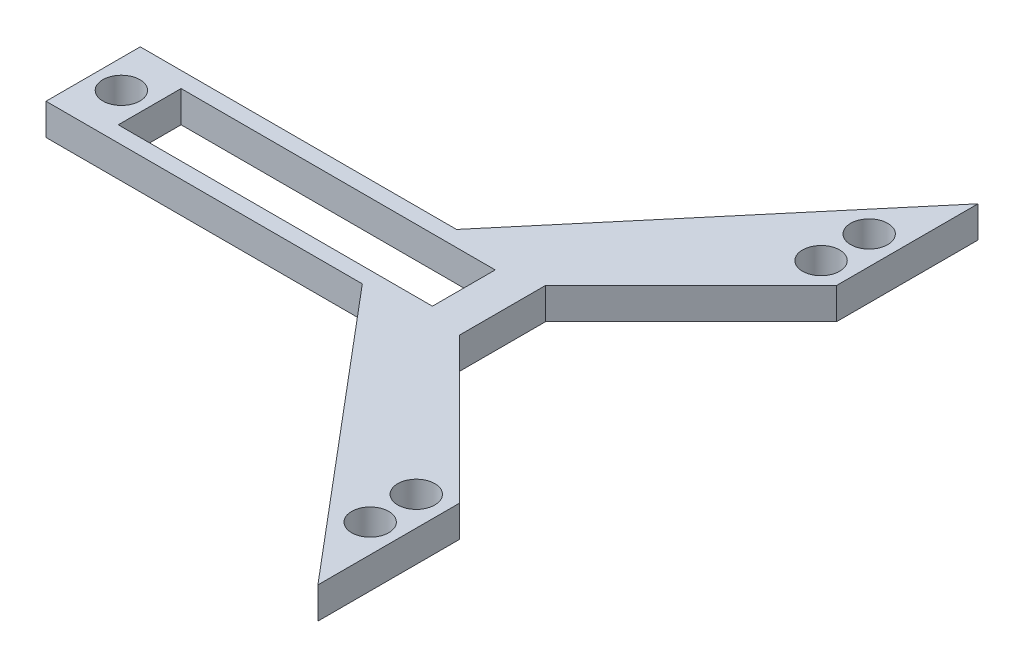
ISO-10303-21;
HEADER;
FILE_DESCRIPTION(('STEP AP214'),'2;1');
FILE_NAME('part.step','',(''),(''),'','','');
FILE_SCHEMA(('AUTOMOTIVE_DESIGN { 1 0 10303 214 1 1 1 1 }'));
ENDSEC;
DATA;
#1=APPLICATION_CONTEXT('core data for automotive mechanical design processes');
#2=APPLICATION_PROTOCOL_DEFINITION('international standard','automotive_design',2000,#1);
#3=PRODUCT_CONTEXT('',#1,'mechanical');
#4=PRODUCT('Part','Part','',(#3));
#5=PRODUCT_RELATED_PRODUCT_CATEGORY('part','',(#4));
#6=PRODUCT_DEFINITION_FORMATION('','',#4);
#7=PRODUCT_DEFINITION_CONTEXT('part definition',#1,'design');
#8=PRODUCT_DEFINITION('design','',#6,#7);
#9=PRODUCT_DEFINITION_SHAPE('','',#8);
#10=(LENGTH_UNIT() NAMED_UNIT(*) SI_UNIT(.MILLI.,.METRE.));
#11=(NAMED_UNIT(*) PLANE_ANGLE_UNIT() SI_UNIT($,.RADIAN.));
#12=(NAMED_UNIT(*) SI_UNIT($,.STERADIAN.) SOLID_ANGLE_UNIT());
#13=UNCERTAINTY_MEASURE_WITH_UNIT(LENGTH_MEASURE(1.E-05),#10,'distance_accuracy_value','');
#14=(GEOMETRIC_REPRESENTATION_CONTEXT(3) GLOBAL_UNCERTAINTY_ASSIGNED_CONTEXT((#13)) GLOBAL_UNIT_ASSIGNED_CONTEXT((#10,
#11,#12)) REPRESENTATION_CONTEXT('',''));
#15=CARTESIAN_POINT('',(0.,0.,0.));
#16=DIRECTION('',(0.,0.,1.));
#17=DIRECTION('',(1.,0.,0.));
#18=AXIS2_PLACEMENT_3D('',#15,#16,#17);
#19=CARTESIAN_POINT('',(-4.29581905287449,2.54,1.27));
#20=DIRECTION('',(0.764582572247931,0.,-0.644525787082827));
#21=DIRECTION('',(-0.644525787082827,0.,-0.764582572247931));
#22=AXIS2_PLACEMENT_3D('',#19,#20,#21);
#23=PLANE('',#22);
#24=DIRECTION('',(0.644525787082827,0.,0.764582572247931));
#25=VECTOR('',#24,1.);
#26=CARTESIAN_POINT('',(-4.29581905287449,0.,1.27));
#27=LINE('',#26,#25);
#28=CARTESIAN_POINT('',(-4.29581905287449,0.,1.27));
#29=VERTEX_POINT('',#28);
#30=CARTESIAN_POINT('',(14.9882776267843,0.,24.1461742948177));
#31=VERTEX_POINT('',#30);
#32=EDGE_CURVE('E228',#29,#31,#27,.T.);
#33=ORIENTED_EDGE('',*,*,#32,.T.);
#34=DIRECTION('',(0.,-1.,0.));
#35=VECTOR('',#34,1.);
#36=CARTESIAN_POINT('',(14.9882776267843,2.54,24.1461742948177));
#37=LINE('',#36,#35);
#38=CARTESIAN_POINT('',(14.9882776267843,2.54,24.1461742948177));
#39=VERTEX_POINT('',#38);
#40=EDGE_CURVE('E11',#39,#31,#37,.T.);
#41=ORIENTED_EDGE('',*,*,#40,.F.);
#42=DIRECTION('',(0.644525787082827,0.,0.764582572247931));
#43=VECTOR('',#42,1.);
#44=CARTESIAN_POINT('',(-4.29581905287449,2.54,1.27));
#45=LINE('',#44,#43);
#46=CARTESIAN_POINT('',(-4.29581905287449,2.54,1.27));
#47=VERTEX_POINT('',#46);
#48=EDGE_CURVE('E194',#47,#39,#45,.T.);
#49=ORIENTED_EDGE('',*,*,#48,.F.);
#50=DIRECTION('',(0.,-1.,0.));
#51=VECTOR('',#50,1.);
#52=CARTESIAN_POINT('',(-4.29581905287449,2.54,1.27));
#53=LINE('',#52,#51);
#54=EDGE_CURVE('E226',#47,#29,#53,.T.);
#55=ORIENTED_EDGE('',*,*,#54,.T.);
#56=EDGE_LOOP('',(#33,#41,#49,#55));
#57=FACE_BOUND('',#56,.T.);
#58=ADVANCED_FACE('F44',(#57),#23,.F.);
#59=CARTESIAN_POINT('',(14.9882776267843,2.54,24.1461742948177));
#60=DIRECTION('',(-1.,0.,0.));
#61=DIRECTION('',(0.,0.,1.));
#62=AXIS2_PLACEMENT_3D('',#59,#60,#61);
#63=PLANE('',#62);
#64=DIRECTION('',(0.,0.,-1.));
#65=VECTOR('',#64,1.);
#66=CARTESIAN_POINT('',(14.9882776267843,0.,24.1461742948177));
#67=LINE('',#66,#65);
#68=CARTESIAN_POINT('',(14.9882776267843,0.,12.7161742948177));
#69=VERTEX_POINT('',#68);
#70=EDGE_CURVE('E231',#31,#69,#67,.T.);
#71=ORIENTED_EDGE('',*,*,#70,.T.);
#72=DIRECTION('',(0.,-1.,0.));
#73=VECTOR('',#72,1.);
#74=CARTESIAN_POINT('',(14.9882776267843,2.54,12.7161742948177));
#75=LINE('',#74,#73);
#76=CARTESIAN_POINT('',(14.9882776267843,2.54,12.7161742948177));
#77=VERTEX_POINT('',#76);
#78=EDGE_CURVE('E52',#77,#69,#75,.T.);
#79=ORIENTED_EDGE('',*,*,#78,.F.);
#80=DIRECTION('',(0.,0.,-1.));
#81=VECTOR('',#80,1.);
#82=CARTESIAN_POINT('',(14.9882776267843,2.54,24.1461742948177));
#83=LINE('',#82,#81);
#84=EDGE_CURVE('E198',#39,#77,#83,.T.);
#85=ORIENTED_EDGE('',*,*,#84,.F.);
#86=ORIENTED_EDGE('',*,*,#40,.T.);
#87=EDGE_LOOP('',(#71,#79,#85,#86));
#88=FACE_BOUND('',#87,.T.);
#89=ADVANCED_FACE('F296',(#88),#63,.F.);
#90=CARTESIAN_POINT('',(3.22186842591949,2.54,0.949765093952835));
#91=DIRECTION('',(0.707106781186549,0.,-0.707106781186546));
#92=DIRECTION('',(-0.707106781186546,0.,-0.707106781186549));
#93=AXIS2_PLACEMENT_3D('',#90,#91,#92);
#94=PLANE('',#93);
#95=DIRECTION('',(0.707106781186546,0.,0.707106781186549));
#96=VECTOR('',#95,1.);
#97=CARTESIAN_POINT('',(3.22186842591949,0.,0.949765093952835));
#98=LINE('',#97,#96);
#99=CARTESIAN_POINT('',(3.22186842591949,0.,0.949765093952835));
#100=VERTEX_POINT('',#99);
#101=EDGE_CURVE('E239',#100,#69,#98,.T.);
#102=ORIENTED_EDGE('',*,*,#101,.F.);
#103=DIRECTION('',(0.,-1.,0.));
#104=VECTOR('',#103,1.);
#105=CARTESIAN_POINT('',(3.22186842591949,2.54,0.949765093952835));
#106=LINE('',#105,#104);
#107=CARTESIAN_POINT('',(3.22186842591949,2.54,0.949765093952835));
#108=VERTEX_POINT('',#107);
#109=EDGE_CURVE('E288',#108,#100,#106,.T.);
#110=ORIENTED_EDGE('',*,*,#109,.F.);
#111=DIRECTION('',(0.707106781186546,0.,0.707106781186549));
#112=VECTOR('',#111,1.);
#113=CARTESIAN_POINT('',(3.22186842591949,2.54,0.949765093952835));
#114=LINE('',#113,#112);
#115=EDGE_CURVE('E199',#108,#77,#114,.T.);
#116=ORIENTED_EDGE('',*,*,#115,.T.);
#117=ORIENTED_EDGE('',*,*,#78,.T.);
#118=EDGE_LOOP('',(#102,#110,#116,#117));
#119=FACE_BOUND('',#118,.T.);
#120=ADVANCED_FACE('F297',(#119),#94,.T.);
#121=CARTESIAN_POINT('',(3.22186842591949,2.54,0.949765093952835));
#122=DIRECTION('',(-1.,0.,0.));
#123=DIRECTION('',(0.,0.,1.));
#124=AXIS2_PLACEMENT_3D('',#121,#122,#123);
#125=PLANE('',#124);
#126=DIRECTION('',(0.,0.,-1.));
#127=VECTOR('',#126,1.);
#128=CARTESIAN_POINT('',(3.22186842591949,0.,0.949765093952835));
#129=LINE('',#128,#127);
#130=CARTESIAN_POINT('',(3.22186842591949,0.,-6.02976509395282));
#131=VERTEX_POINT('',#130);
#132=EDGE_CURVE('E244',#100,#131,#129,.T.);
#133=ORIENTED_EDGE('',*,*,#132,.T.);
#134=DIRECTION('',(0.,-1.,0.));
#135=VECTOR('',#134,1.);
#136=CARTESIAN_POINT('',(3.22186842591949,2.54,-6.02976509395282));
#137=LINE('',#136,#135);
#138=CARTESIAN_POINT('',(3.22186842591949,2.54,-6.02976509395282));
#139=VERTEX_POINT('',#138);
#140=EDGE_CURVE('E287',#139,#131,#137,.T.);
#141=ORIENTED_EDGE('',*,*,#140,.F.);
#142=DIRECTION('',(0.,0.,-1.));
#143=VECTOR('',#142,1.);
#144=CARTESIAN_POINT('',(3.22186842591949,2.54,0.949765093952835));
#145=LINE('',#144,#143);
#146=EDGE_CURVE('E204',#108,#139,#145,.T.);
#147=ORIENTED_EDGE('',*,*,#146,.F.);
#148=ORIENTED_EDGE('',*,*,#109,.T.);
#149=EDGE_LOOP('',(#133,#141,#147,#148));
#150=FACE_BOUND('',#149,.T.);
#151=ADVANCED_FACE('F306',(#150),#125,.F.);
#152=CARTESIAN_POINT('',(3.22186842591949,2.54,-6.02976509395282));
#153=DIRECTION('',(-0.707106781186549,0.,-0.707106781186546));
#154=DIRECTION('',(-0.707106781186546,0.,0.707106781186549));
#155=AXIS2_PLACEMENT_3D('',#152,#153,#154);
#156=PLANE('',#155);
#157=DIRECTION('',(0.707106781186546,0.,-0.707106781186549));
#158=VECTOR('',#157,1.);
#159=CARTESIAN_POINT('',(3.22186842591949,0.,-6.02976509395282));
#160=LINE('',#159,#158);
#161=CARTESIAN_POINT('',(14.9882776267843,0.,-17.7961742948177));
#162=VERTEX_POINT('',#161);
#163=EDGE_CURVE('E247',#131,#162,#160,.T.);
#164=ORIENTED_EDGE('',*,*,#163,.T.);
#165=DIRECTION('',(0.,-1.,0.));
#166=VECTOR('',#165,1.);
#167=CARTESIAN_POINT('',(14.9882776267843,2.54,-17.7961742948177));
#168=LINE('',#167,#166);
#169=CARTESIAN_POINT('',(14.9882776267843,2.54,-17.7961742948177));
#170=VERTEX_POINT('',#169);
#171=EDGE_CURVE('E284',#170,#162,#168,.T.);
#172=ORIENTED_EDGE('',*,*,#171,.F.);
#173=DIRECTION('',(0.707106781186546,0.,-0.707106781186549));
#174=VECTOR('',#173,1.);
#175=CARTESIAN_POINT('',(3.22186842591949,2.54,-6.02976509395282));
#176=LINE('',#175,#174);
#177=EDGE_CURVE('E210',#139,#170,#176,.T.);
#178=ORIENTED_EDGE('',*,*,#177,.F.);
#179=ORIENTED_EDGE('',*,*,#140,.T.);
#180=EDGE_LOOP('',(#164,#172,#178,#179));
#181=FACE_BOUND('',#180,.T.);
#182=ADVANCED_FACE('F315',(#181),#156,.F.);
#183=CARTESIAN_POINT('',(14.9882776267843,2.54,-29.2261742948177));
#184=DIRECTION('',(1.,0.,0.));
#185=DIRECTION('',(0.,0.,-1.));
#186=AXIS2_PLACEMENT_3D('',#183,#184,#185);
#187=PLANE('',#186);
#188=DIRECTION('',(0.,0.,1.));
#189=VECTOR('',#188,1.);
#190=CARTESIAN_POINT('',(14.9882776267843,0.,-29.2261742948177));
#191=LINE('',#190,#189);
#192=CARTESIAN_POINT('',(14.9882776267843,0.,-29.2261742948177));
#193=VERTEX_POINT('',#192);
#194=EDGE_CURVE('E248',#193,#162,#191,.T.);
#195=ORIENTED_EDGE('',*,*,#194,.F.);
#196=DIRECTION('',(0.,-1.,0.));
#197=VECTOR('',#196,1.);
#198=CARTESIAN_POINT('',(14.9882776267843,2.54,-29.2261742948177));
#199=LINE('',#198,#197);
#200=CARTESIAN_POINT('',(14.9882776267843,2.54,-29.2261742948177));
#201=VERTEX_POINT('',#200);
#202=EDGE_CURVE('E278',#201,#193,#199,.T.);
#203=ORIENTED_EDGE('',*,*,#202,.F.);
#204=DIRECTION('',(0.,0.,1.));
#205=VECTOR('',#204,1.);
#206=CARTESIAN_POINT('',(14.9882776267843,2.54,-29.2261742948177));
#207=LINE('',#206,#205);
#208=EDGE_CURVE('E209',#201,#170,#207,.T.);
#209=ORIENTED_EDGE('',*,*,#208,.T.);
#210=ORIENTED_EDGE('',*,*,#171,.T.);
#211=EDGE_LOOP('',(#195,#203,#209,#210));
#212=FACE_BOUND('',#211,.T.);
#213=ADVANCED_FACE('F333',(#212),#187,.T.);
#214=CARTESIAN_POINT('',(-4.29581905287449,2.54,-6.34999999999999));
#215=DIRECTION('',(-0.764582572247931,0.,-0.644525787082827));
#216=DIRECTION('',(-0.644525787082827,0.,0.764582572247931));
#217=AXIS2_PLACEMENT_3D('',#214,#215,#216);
#218=PLANE('',#217);
#219=DIRECTION('',(0.644525787082827,0.,-0.764582572247931));
#220=VECTOR('',#219,1.);
#221=CARTESIAN_POINT('',(-4.29581905287449,0.,-6.34999999999999));
#222=LINE('',#221,#220);
#223=CARTESIAN_POINT('',(-4.29581905287449,0.,-6.34999999999999));
#224=VERTEX_POINT('',#223);
#225=EDGE_CURVE('E255',#224,#193,#222,.T.);
#226=ORIENTED_EDGE('',*,*,#225,.F.);
#227=DIRECTION('',(0.,-1.,0.));
#228=VECTOR('',#227,1.);
#229=CARTESIAN_POINT('',(-4.29581905287449,2.54,-6.34999999999999));
#230=LINE('',#229,#228);
#231=CARTESIAN_POINT('',(-4.29581905287449,2.54,-6.34999999999999));
#232=VERTEX_POINT('',#231);
#233=EDGE_CURVE('E280',#232,#224,#230,.T.);
#234=ORIENTED_EDGE('',*,*,#233,.F.);
#235=DIRECTION('',(0.644525787082827,0.,-0.764582572247931));
#236=VECTOR('',#235,1.);
#237=CARTESIAN_POINT('',(-4.29581905287449,2.54,-6.34999999999999));
#238=LINE('',#237,#236);
#239=EDGE_CURVE('E212',#232,#201,#238,.T.);
#240=ORIENTED_EDGE('',*,*,#239,.T.);
#241=ORIENTED_EDGE('',*,*,#202,.T.);
#242=EDGE_LOOP('',(#226,#234,#240,#241));
#243=FACE_BOUND('',#242,.T.);
#244=ADVANCED_FACE('F332',(#243),#218,.T.);
#245=CARTESIAN_POINT('',(-4.29581905287449,2.54,-6.34999999999999));
#246=DIRECTION('',(0.,0.,1.));
#247=DIRECTION('',(1.,0.,0.));
#248=AXIS2_PLACEMENT_3D('',#245,#246,#247);
#249=PLANE('',#248);
#250=DIRECTION('',(-1.,0.,0.));
#251=VECTOR('',#250,1.);
#252=CARTESIAN_POINT('',(-4.29581905287449,0.,-6.34999999999999));
#253=LINE('',#252,#251);
#254=CARTESIAN_POINT('',(-29.8704,0.,-6.34999999999999));
#255=VERTEX_POINT('',#254);
#256=EDGE_CURVE('E256',#224,#255,#253,.T.);
#257=ORIENTED_EDGE('',*,*,#256,.T.);
#258=DIRECTION('',(0.,-1.,0.));
#259=VECTOR('',#258,1.);
#260=CARTESIAN_POINT('',(-29.8704,2.54,-6.34999999999999));
#261=LINE('',#260,#259);
#262=CARTESIAN_POINT('',(-29.8704,2.54,-6.34999999999999));
#263=VERTEX_POINT('',#262);
#264=EDGE_CURVE('E273',#263,#255,#261,.T.);
#265=ORIENTED_EDGE('',*,*,#264,.F.);
#266=DIRECTION('',(-1.,0.,0.));
#267=VECTOR('',#266,1.);
#268=CARTESIAN_POINT('',(-4.29581905287449,2.54,-6.34999999999999));
#269=LINE('',#268,#267);
#270=EDGE_CURVE('E217',#232,#263,#269,.T.);
#271=ORIENTED_EDGE('',*,*,#270,.F.);
#272=ORIENTED_EDGE('',*,*,#233,.T.);
#273=EDGE_LOOP('',(#257,#265,#271,#272));
#274=FACE_BOUND('',#273,.T.);
#275=ADVANCED_FACE('F344',(#274),#249,.F.);
#276=CARTESIAN_POINT('',(-29.8704,2.54,1.27000000000001));
#277=DIRECTION('',(-1.,0.,0.));
#278=DIRECTION('',(0.,0.,1.));
#279=AXIS2_PLACEMENT_3D('',#276,#277,#278);
#280=PLANE('',#279);
#281=DIRECTION('',(0.,0.,-1.));
#282=VECTOR('',#281,1.);
#283=CARTESIAN_POINT('',(-29.8704,0.,1.27000000000001));
#284=LINE('',#283,#282);
#285=CARTESIAN_POINT('',(-29.8704,0.,1.27000000000001));
#286=VERTEX_POINT('',#285);
#287=EDGE_CURVE('E265',#286,#255,#284,.T.);
#288=ORIENTED_EDGE('',*,*,#287,.F.);
#289=DIRECTION('',(0.,-1.,0.));
#290=VECTOR('',#289,1.);
#291=CARTESIAN_POINT('',(-29.8704,2.54,1.27000000000001));
#292=LINE('',#291,#290);
#293=CARTESIAN_POINT('',(-29.8704,2.54,1.27000000000001));
#294=VERTEX_POINT('',#293);
#295=EDGE_CURVE('E271',#294,#286,#292,.T.);
#296=ORIENTED_EDGE('',*,*,#295,.F.);
#297=DIRECTION('',(0.,0.,-1.));
#298=VECTOR('',#297,1.);
#299=CARTESIAN_POINT('',(-29.8704,2.54,1.27000000000001));
#300=LINE('',#299,#298);
#301=EDGE_CURVE('E222',#294,#263,#300,.T.);
#302=ORIENTED_EDGE('',*,*,#301,.T.);
#303=ORIENTED_EDGE('',*,*,#264,.T.);
#304=EDGE_LOOP('',(#288,#296,#302,#303));
#305=FACE_BOUND('',#304,.T.);
#306=ADVANCED_FACE('F324',(#305),#280,.T.);
#307=CARTESIAN_POINT('',(-4.29581905287449,2.54,1.27));
#308=DIRECTION('',(0.,0.,1.));
#309=DIRECTION('',(1.,0.,0.));
#310=AXIS2_PLACEMENT_3D('',#307,#308,#309);
#311=PLANE('',#310);
#312=DIRECTION('',(-1.,0.,0.));
#313=VECTOR('',#312,1.);
#314=CARTESIAN_POINT('',(-4.29581905287449,0.,1.27));
#315=LINE('',#314,#313);
#316=EDGE_CURVE('E197',#29,#286,#315,.T.);
#317=ORIENTED_EDGE('',*,*,#316,.F.);
#318=ORIENTED_EDGE('',*,*,#54,.F.);
#319=DIRECTION('',(-1.,0.,0.));
#320=VECTOR('',#319,1.);
#321=CARTESIAN_POINT('',(-4.29581905287449,2.54,1.27));
#322=LINE('',#321,#320);
#323=EDGE_CURVE('E223',#47,#294,#322,.T.);
#324=ORIENTED_EDGE('',*,*,#323,.T.);
#325=ORIENTED_EDGE('',*,*,#295,.T.);
#326=EDGE_LOOP('',(#317,#318,#324,#325));
#327=FACE_BOUND('',#326,.T.);
#328=ADVANCED_FACE('F325',(#327),#311,.T.);
#329=CARTESIAN_POINT('',(0.,2.54,0.));
#330=DIRECTION('',(0.,1.,0.));
#331=DIRECTION('',(0.,0.,1.));
#332=AXIS2_PLACEMENT_3D('',#329,#330,#331);
#333=PLANE('',#332);
#334=CARTESIAN_POINT('',(-27.5844,2.54,-2.53999999999999));
#335=DIRECTION('',(0.,1.,0.));
#336=DIRECTION('',(0.,0.,1.));
#337=AXIS2_PLACEMENT_3D('',#334,#335,#336);
#338=CIRCLE('',#337,1.4986);
#339=CARTESIAN_POINT('',(-27.5844,2.54,-1.04139999999999));
#340=VERTEX_POINT('',#339);
#341=EDGE_CURVE('E508',#340,#340,#338,.T.);
#342=ORIENTED_EDGE('',*,*,#341,.F.);
#343=EDGE_LOOP('',(#342));
#344=FACE_BOUND('',#343,.T.);
#345=CARTESIAN_POINT('',(12.7022776267843,2.54,-22.7133111624649));
#346=DIRECTION('',(0.,1.,0.));
#347=DIRECTION('',(0.,0.,1.));
#348=AXIS2_PLACEMENT_3D('',#345,#346,#347);
#349=CIRCLE('',#348,1.4986);
#350=CARTESIAN_POINT('',(12.7022776267843,2.54,-21.2147111624649));
#351=VERTEX_POINT('',#350);
#352=EDGE_CURVE('E515',#351,#351,#349,.T.);
#353=ORIENTED_EDGE('',*,*,#352,.F.);
#354=EDGE_LOOP('',(#353));
#355=FACE_BOUND('',#354,.T.);
#356=CARTESIAN_POINT('',(12.622030753034,2.54,-18.9041563429212));
#357=DIRECTION('',(0.,1.,0.));
#358=DIRECTION('',(0.,0.,1.));
#359=AXIS2_PLACEMENT_3D('',#356,#357,#358);
#360=CIRCLE('',#359,1.4986);
#361=CARTESIAN_POINT('',(12.622030753034,2.54,-17.4055563429212));
#362=VERTEX_POINT('',#361);
#363=EDGE_CURVE('E521',#362,#362,#360,.T.);
#364=ORIENTED_EDGE('',*,*,#363,.F.);
#365=EDGE_LOOP('',(#364));
#366=FACE_BOUND('',#365,.T.);
#367=CARTESIAN_POINT('',(12.622030753034,2.54,13.8241563429212));
#368=DIRECTION('',(0.,1.,0.));
#369=DIRECTION('',(0.,0.,-1.));
#370=AXIS2_PLACEMENT_3D('',#367,#368,#369);
#371=CIRCLE('',#370,1.4986);
#372=CARTESIAN_POINT('',(12.622030753034,2.54,12.3255563429212));
#373=VERTEX_POINT('',#372);
#374=EDGE_CURVE('E535',#373,#373,#371,.T.);
#375=ORIENTED_EDGE('',*,*,#374,.F.);
#376=EDGE_LOOP('',(#375));
#377=FACE_BOUND('',#376,.T.);
#378=CARTESIAN_POINT('',(12.7022776267843,2.54,17.6333111624649));
#379=DIRECTION('',(0.,1.,0.));
#380=DIRECTION('',(0.,0.,-1.));
#381=AXIS2_PLACEMENT_3D('',#378,#379,#380);
#382=CIRCLE('',#381,1.4986);
#383=CARTESIAN_POINT('',(12.7022776267843,2.54,16.1347111624649));
#384=VERTEX_POINT('',#383);
#385=EDGE_CURVE('E173',#384,#384,#382,.T.);
#386=ORIENTED_EDGE('',*,*,#385,.F.);
#387=EDGE_LOOP('',(#386));
#388=FACE_BOUND('',#387,.T.);
#389=DIRECTION('',(0.,0.,1.));
#390=VECTOR('',#389,1.);
#391=CARTESIAN_POINT('',(-25.2984,2.54,-5.07999999999999));
#392=LINE('',#391,#390);
#393=CARTESIAN_POINT('',(-25.2984,2.54,-5.07999999999999));
#394=VERTEX_POINT('',#393);
#395=CARTESIAN_POINT('',(-25.2984,2.54,0.));
#396=VERTEX_POINT('',#395);
#397=EDGE_CURVE('E58',#394,#396,#392,.T.);
#398=ORIENTED_EDGE('',*,*,#397,.F.);
#399=DIRECTION('',(-1.,0.,0.));
#400=VECTOR('',#399,1.);
#401=CARTESIAN_POINT('',(0.1016,2.54,-5.08));
#402=LINE('',#401,#400);
#403=CARTESIAN_POINT('',(0.1016,2.54,-5.08));
#404=VERTEX_POINT('',#403);
#405=EDGE_CURVE('E156',#404,#394,#402,.T.);
#406=ORIENTED_EDGE('',*,*,#405,.F.);
#407=DIRECTION('',(0.,0.,-1.));
#408=VECTOR('',#407,1.);
#409=CARTESIAN_POINT('',(0.1016,2.54,-5.08));
#410=LINE('',#409,#408);
#411=CARTESIAN_POINT('',(0.101600000000001,2.54,0.));
#412=VERTEX_POINT('',#411);
#413=EDGE_CURVE('E165',#412,#404,#410,.T.);
#414=ORIENTED_EDGE('',*,*,#413,.F.);
#415=DIRECTION('',(1.,0.,0.));
#416=VECTOR('',#415,1.);
#417=CARTESIAN_POINT('',(0.101600000000001,2.54,0.));
#418=LINE('',#417,#416);
#419=EDGE_CURVE('E169',#396,#412,#418,.T.);
#420=ORIENTED_EDGE('',*,*,#419,.F.);
#421=EDGE_LOOP('',(#398,#406,#414,#420));
#422=FACE_BOUND('',#421,.T.);
#423=ORIENTED_EDGE('',*,*,#48,.T.);
#424=ORIENTED_EDGE('',*,*,#84,.T.);
#425=ORIENTED_EDGE('',*,*,#115,.F.);
#426=ORIENTED_EDGE('',*,*,#146,.T.);
#427=ORIENTED_EDGE('',*,*,#177,.T.);
#428=ORIENTED_EDGE('',*,*,#208,.F.);
#429=ORIENTED_EDGE('',*,*,#239,.F.);
#430=ORIENTED_EDGE('',*,*,#270,.T.);
#431=ORIENTED_EDGE('',*,*,#301,.F.);
#432=ORIENTED_EDGE('',*,*,#323,.F.);
#433=EDGE_LOOP('',(#423,#424,#425,#426,#427,#428,#429,#430,#431,#432));
#434=FACE_BOUND('',#433,.T.);
#435=ADVANCED_FACE('F164',(#344,#355,#366,#377,#388,#422,#434),#333,.T.);
#436=CARTESIAN_POINT('',(0.,0.,0.));
#437=DIRECTION('',(0.,1.,0.));
#438=DIRECTION('',(0.,0.,1.));
#439=AXIS2_PLACEMENT_3D('',#436,#437,#438);
#440=PLANE('',#439);
#441=CARTESIAN_POINT('',(-27.5844,0.,-2.53999999999999));
#442=DIRECTION('',(0.,1.,0.));
#443=DIRECTION('',(0.,0.,1.));
#444=AXIS2_PLACEMENT_3D('',#441,#442,#443);
#445=CIRCLE('',#444,1.4986);
#446=CARTESIAN_POINT('',(-27.5844,0.,-1.04139999999999));
#447=VERTEX_POINT('',#446);
#448=EDGE_CURVE('E233',#447,#447,#445,.T.);
#449=ORIENTED_EDGE('',*,*,#448,.T.);
#450=EDGE_LOOP('',(#449));
#451=FACE_BOUND('',#450,.T.);
#452=CARTESIAN_POINT('',(12.7022776267843,0.,-22.7133111624649));
#453=DIRECTION('',(0.,1.,0.));
#454=DIRECTION('',(0.,0.,1.));
#455=AXIS2_PLACEMENT_3D('',#452,#453,#454);
#456=CIRCLE('',#455,1.4986);
#457=CARTESIAN_POINT('',(12.7022776267843,0.,-21.2147111624649));
#458=VERTEX_POINT('',#457);
#459=EDGE_CURVE('E519',#458,#458,#456,.T.);
#460=ORIENTED_EDGE('',*,*,#459,.T.);
#461=EDGE_LOOP('',(#460));
#462=FACE_BOUND('',#461,.T.);
#463=CARTESIAN_POINT('',(12.622030753034,0.,-18.9041563429212));
#464=DIRECTION('',(0.,1.,0.));
#465=DIRECTION('',(0.,0.,1.));
#466=AXIS2_PLACEMENT_3D('',#463,#464,#465);
#467=CIRCLE('',#466,1.4986);
#468=CARTESIAN_POINT('',(12.622030753034,0.,-17.4055563429212));
#469=VERTEX_POINT('',#468);
#470=EDGE_CURVE('E526',#469,#469,#467,.T.);
#471=ORIENTED_EDGE('',*,*,#470,.T.);
#472=EDGE_LOOP('',(#471));
#473=FACE_BOUND('',#472,.T.);
#474=CARTESIAN_POINT('',(12.622030753034,0.,13.8241563429212));
#475=DIRECTION('',(0.,1.,0.));
#476=DIRECTION('',(0.,0.,-1.));
#477=AXIS2_PLACEMENT_3D('',#474,#475,#476);
#478=CIRCLE('',#477,1.4986);
#479=CARTESIAN_POINT('',(12.622030753034,0.,12.3255563429212));
#480=VERTEX_POINT('',#479);
#481=EDGE_CURVE('E536',#480,#480,#478,.T.);
#482=ORIENTED_EDGE('',*,*,#481,.T.);
#483=EDGE_LOOP('',(#482));
#484=FACE_BOUND('',#483,.T.);
#485=CARTESIAN_POINT('',(12.7022776267843,0.,17.6333111624649));
#486=DIRECTION('',(0.,1.,0.));
#487=DIRECTION('',(0.,0.,-1.));
#488=AXIS2_PLACEMENT_3D('',#485,#486,#487);
#489=CIRCLE('',#488,1.4986);
#490=CARTESIAN_POINT('',(12.7022776267843,0.,16.1347111624649));
#491=VERTEX_POINT('',#490);
#492=EDGE_CURVE('E168',#491,#491,#489,.T.);
#493=ORIENTED_EDGE('',*,*,#492,.T.);
#494=EDGE_LOOP('',(#493));
#495=FACE_BOUND('',#494,.T.);
#496=DIRECTION('',(-1.,0.,0.));
#497=VECTOR('',#496,1.);
#498=CARTESIAN_POINT('',(0.1016,0.,-5.08));
#499=LINE('',#498,#497);
#500=CARTESIAN_POINT('',(0.1016,0.,-5.08));
#501=VERTEX_POINT('',#500);
#502=CARTESIAN_POINT('',(-25.2984,0.,-5.07999999999999));
#503=VERTEX_POINT('',#502);
#504=EDGE_CURVE('E178',#501,#503,#499,.T.);
#505=ORIENTED_EDGE('',*,*,#504,.T.);
#506=DIRECTION('',(0.,0.,1.));
#507=VECTOR('',#506,1.);
#508=CARTESIAN_POINT('',(-25.2984,0.,-5.07999999999999));
#509=LINE('',#508,#507);
#510=CARTESIAN_POINT('',(-25.2984,0.,0.));
#511=VERTEX_POINT('',#510);
#512=EDGE_CURVE('E146',#503,#511,#509,.T.);
#513=ORIENTED_EDGE('',*,*,#512,.T.);
#514=DIRECTION('',(1.,0.,0.));
#515=VECTOR('',#514,1.);
#516=CARTESIAN_POINT('',(0.101600000000001,0.,0.));
#517=LINE('',#516,#515);
#518=CARTESIAN_POINT('',(0.101600000000001,0.,0.));
#519=VERTEX_POINT('',#518);
#520=EDGE_CURVE('E187',#511,#519,#517,.T.);
#521=ORIENTED_EDGE('',*,*,#520,.T.);
#522=DIRECTION('',(0.,0.,-1.));
#523=VECTOR('',#522,1.);
#524=CARTESIAN_POINT('',(0.1016,0.,-5.08));
#525=LINE('',#524,#523);
#526=EDGE_CURVE('E70',#519,#501,#525,.T.);
#527=ORIENTED_EDGE('',*,*,#526,.T.);
#528=EDGE_LOOP('',(#505,#513,#521,#527));
#529=FACE_BOUND('',#528,.T.);
#530=ORIENTED_EDGE('',*,*,#32,.F.);
#531=ORIENTED_EDGE('',*,*,#316,.T.);
#532=ORIENTED_EDGE('',*,*,#287,.T.);
#533=ORIENTED_EDGE('',*,*,#256,.F.);
#534=ORIENTED_EDGE('',*,*,#225,.T.);
#535=ORIENTED_EDGE('',*,*,#194,.T.);
#536=ORIENTED_EDGE('',*,*,#163,.F.);
#537=ORIENTED_EDGE('',*,*,#132,.F.);
#538=ORIENTED_EDGE('',*,*,#101,.T.);
#539=ORIENTED_EDGE('',*,*,#70,.F.);
#540=EDGE_LOOP('',(#530,#531,#532,#533,#534,#535,#536,#537,#538,#539));
#541=FACE_BOUND('',#540,.T.);
#542=ADVANCED_FACE('F301',(#451,#462,#473,#484,#495,#529,#541),#440,.F.);
#543=CARTESIAN_POINT('',(-25.2984,0.,-5.07999999999999));
#544=DIRECTION('',(-1.,0.,0.));
#545=DIRECTION('',(0.,0.,1.));
#546=AXIS2_PLACEMENT_3D('',#543,#544,#545);
#547=PLANE('',#546);
#548=ORIENTED_EDGE('',*,*,#397,.T.);
#549=DIRECTION('',(0.,1.,0.));
#550=VECTOR('',#549,1.);
#551=CARTESIAN_POINT('',(-25.2984,0.,0.));
#552=LINE('',#551,#550);
#553=EDGE_CURVE('E181',#511,#396,#552,.T.);
#554=ORIENTED_EDGE('',*,*,#553,.F.);
#555=ORIENTED_EDGE('',*,*,#512,.F.);
#556=DIRECTION('',(0.,1.,0.));
#557=VECTOR('',#556,1.);
#558=CARTESIAN_POINT('',(-25.2984,0.,-5.07999999999999));
#559=LINE('',#558,#557);
#560=EDGE_CURVE('E145',#503,#394,#559,.T.);
#561=ORIENTED_EDGE('',*,*,#560,.T.);
#562=EDGE_LOOP('',(#548,#554,#555,#561));
#563=FACE_BOUND('',#562,.T.);
#564=ADVANCED_FACE('F148',(#563),#547,.F.);
#565=CARTESIAN_POINT('',(0.1016,0.,-5.08));
#566=DIRECTION('',(0.,0.,-1.));
#567=DIRECTION('',(-1.,0.,0.));
#568=AXIS2_PLACEMENT_3D('',#565,#566,#567);
#569=PLANE('',#568);
#570=ORIENTED_EDGE('',*,*,#405,.T.);
#571=ORIENTED_EDGE('',*,*,#560,.F.);
#572=ORIENTED_EDGE('',*,*,#504,.F.);
#573=DIRECTION('',(0.,1.,0.));
#574=VECTOR('',#573,1.);
#575=CARTESIAN_POINT('',(0.1016,0.,-5.08));
#576=LINE('',#575,#574);
#577=EDGE_CURVE('E153',#501,#404,#576,.T.);
#578=ORIENTED_EDGE('',*,*,#577,.T.);
#579=EDGE_LOOP('',(#570,#571,#572,#578));
#580=FACE_BOUND('',#579,.T.);
#581=ADVANCED_FACE('F160',(#580),#569,.F.);
#582=CARTESIAN_POINT('',(0.1016,0.,-5.08));
#583=DIRECTION('',(1.,0.,0.));
#584=DIRECTION('',(0.,0.,-1.));
#585=AXIS2_PLACEMENT_3D('',#582,#583,#584);
#586=PLANE('',#585);
#587=ORIENTED_EDGE('',*,*,#413,.T.);
#588=ORIENTED_EDGE('',*,*,#577,.F.);
#589=ORIENTED_EDGE('',*,*,#526,.F.);
#590=DIRECTION('',(0.,1.,0.));
#591=VECTOR('',#590,1.);
#592=CARTESIAN_POINT('',(0.101600000000001,0.,0.));
#593=LINE('',#592,#591);
#594=EDGE_CURVE('E544',#519,#412,#593,.T.);
#595=ORIENTED_EDGE('',*,*,#594,.T.);
#596=EDGE_LOOP('',(#587,#588,#589,#595));
#597=FACE_BOUND('',#596,.T.);
#598=ADVANCED_FACE('F432',(#597),#586,.F.);
#599=CARTESIAN_POINT('',(0.101600000000001,0.,0.));
#600=DIRECTION('',(0.,0.,1.));
#601=DIRECTION('',(1.,0.,0.));
#602=AXIS2_PLACEMENT_3D('',#599,#600,#601);
#603=PLANE('',#602);
#604=ORIENTED_EDGE('',*,*,#419,.T.);
#605=ORIENTED_EDGE('',*,*,#594,.F.);
#606=ORIENTED_EDGE('',*,*,#520,.F.);
#607=ORIENTED_EDGE('',*,*,#553,.T.);
#608=EDGE_LOOP('',(#604,#605,#606,#607));
#609=FACE_BOUND('',#608,.T.);
#610=ADVANCED_FACE('F444',(#609),#603,.F.);
#611=CARTESIAN_POINT('',(12.7022776267843,0.,17.6333111624649));
#612=DIRECTION('',(0.,1.,0.));
#613=DIRECTION('',(0.,0.,1.));
#614=AXIS2_PLACEMENT_3D('',#611,#612,#613);
#615=CYLINDRICAL_SURFACE('',#614,1.4986);
#616=ORIENTED_EDGE('',*,*,#492,.F.);
#617=EDGE_LOOP('',(#616));
#618=FACE_BOUND('',#617,.T.);
#619=ORIENTED_EDGE('',*,*,#385,.T.);
#620=EDGE_LOOP('',(#619));
#621=FACE_BOUND('',#620,.T.);
#622=ADVANCED_FACE('F454',(#618,#621),#615,.F.);
#623=CARTESIAN_POINT('',(12.622030753034,0.,13.8241563429212));
#624=DIRECTION('',(0.,1.,0.));
#625=DIRECTION('',(0.,0.,1.));
#626=AXIS2_PLACEMENT_3D('',#623,#624,#625);
#627=CYLINDRICAL_SURFACE('',#626,1.4986);
#628=ORIENTED_EDGE('',*,*,#481,.F.);
#629=EDGE_LOOP('',(#628));
#630=FACE_BOUND('',#629,.T.);
#631=ORIENTED_EDGE('',*,*,#374,.T.);
#632=EDGE_LOOP('',(#631));
#633=FACE_BOUND('',#632,.T.);
#634=ADVANCED_FACE('F465',(#630,#633),#627,.F.);
#635=CARTESIAN_POINT('',(12.622030753034,0.,-18.9041563429212));
#636=DIRECTION('',(0.,1.,0.));
#637=DIRECTION('',(0.,0.,1.));
#638=AXIS2_PLACEMENT_3D('',#635,#636,#637);
#639=CYLINDRICAL_SURFACE('',#638,1.4986);
#640=ORIENTED_EDGE('',*,*,#470,.F.);
#641=EDGE_LOOP('',(#640));
#642=FACE_BOUND('',#641,.T.);
#643=ORIENTED_EDGE('',*,*,#363,.T.);
#644=EDGE_LOOP('',(#643));
#645=FACE_BOUND('',#644,.T.);
#646=ADVANCED_FACE('F472',(#642,#645),#639,.F.);
#647=CARTESIAN_POINT('',(12.7022776267843,0.,-22.7133111624649));
#648=DIRECTION('',(0.,1.,0.));
#649=DIRECTION('',(0.,0.,1.));
#650=AXIS2_PLACEMENT_3D('',#647,#648,#649);
#651=CYLINDRICAL_SURFACE('',#650,1.4986);
#652=ORIENTED_EDGE('',*,*,#459,.F.);
#653=EDGE_LOOP('',(#652));
#654=FACE_BOUND('',#653,.T.);
#655=ORIENTED_EDGE('',*,*,#352,.T.);
#656=EDGE_LOOP('',(#655));
#657=FACE_BOUND('',#656,.T.);
#658=ADVANCED_FACE('F485',(#654,#657),#651,.F.);
#659=CARTESIAN_POINT('',(-27.5844,0.,-2.53999999999999));
#660=DIRECTION('',(0.,1.,0.));
#661=DIRECTION('',(0.,0.,1.));
#662=AXIS2_PLACEMENT_3D('',#659,#660,#661);
#663=CYLINDRICAL_SURFACE('',#662,1.4986);
#664=ORIENTED_EDGE('',*,*,#448,.F.);
#665=EDGE_LOOP('',(#664));
#666=FACE_BOUND('',#665,.T.);
#667=ORIENTED_EDGE('',*,*,#341,.T.);
#668=EDGE_LOOP('',(#667));
#669=FACE_BOUND('',#668,.T.);
#670=ADVANCED_FACE('F495',(#666,#669),#663,.F.);
#671=CLOSED_SHELL('',(#58,#89,#120,#151,#182,#213,#244,#275,#306,#328,#435,#542,#564,#581,#598,
#610,#622,#634,#646,#658,#670));
#672=MANIFOLD_SOLID_BREP('B2',#671);
#673=ADVANCED_BREP_SHAPE_REPRESENTATION('',(#18,#672),#14);
#674=SHAPE_DEFINITION_REPRESENTATION(#9,#673);
ENDSEC;
END-ISO-10303-21;
